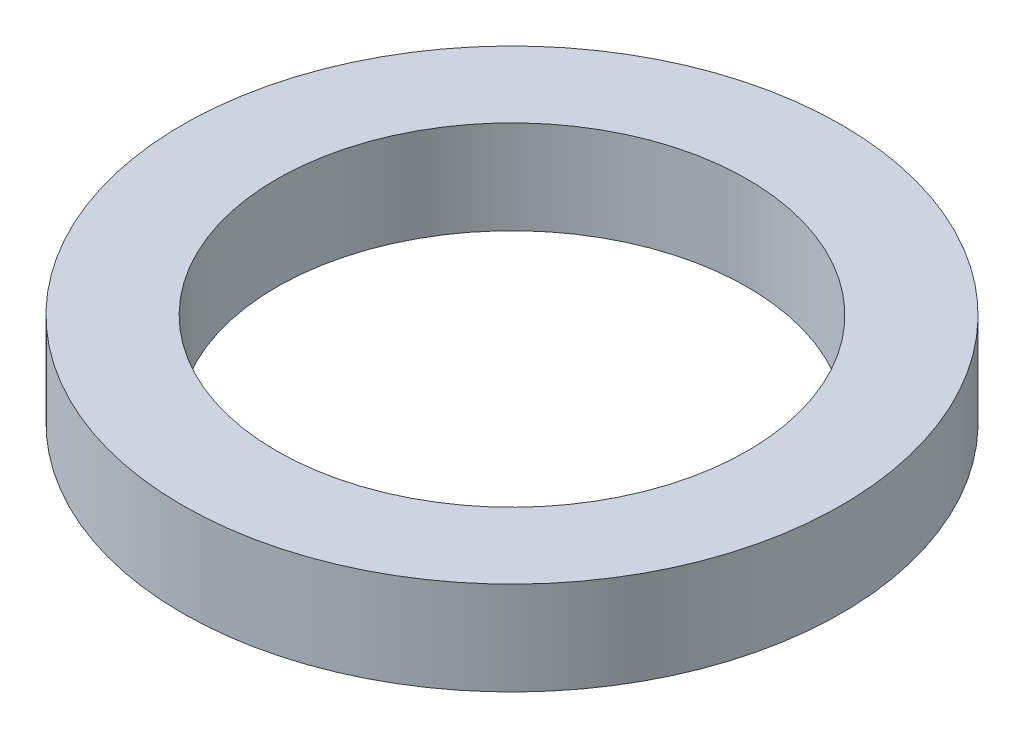
ISO-10303-21;
HEADER;
FILE_DESCRIPTION(('STEP AP214'),'2;1');
FILE_NAME('part.step','',(''),(''),'','','');
FILE_SCHEMA(('AUTOMOTIVE_DESIGN { 1 0 10303 214 1 1 1 1 }'));
ENDSEC;
DATA;
#1=APPLICATION_CONTEXT('core data for automotive mechanical design processes');
#2=APPLICATION_PROTOCOL_DEFINITION('international standard','automotive_design',2000,#1);
#3=PRODUCT_CONTEXT('',#1,'mechanical');
#4=PRODUCT('Part','Part','',(#3));
#5=PRODUCT_RELATED_PRODUCT_CATEGORY('part','',(#4));
#6=PRODUCT_DEFINITION_FORMATION('','',#4);
#7=PRODUCT_DEFINITION_CONTEXT('part definition',#1,'design');
#8=PRODUCT_DEFINITION('design','',#6,#7);
#9=PRODUCT_DEFINITION_SHAPE('','',#8);
#10=(LENGTH_UNIT() NAMED_UNIT(*) SI_UNIT(.MILLI.,.METRE.));
#11=(NAMED_UNIT(*) PLANE_ANGLE_UNIT() SI_UNIT($,.RADIAN.));
#12=(NAMED_UNIT(*) SI_UNIT($,.STERADIAN.) SOLID_ANGLE_UNIT());
#13=UNCERTAINTY_MEASURE_WITH_UNIT(LENGTH_MEASURE(1.E-05),#10,'distance_accuracy_value','');
#14=(GEOMETRIC_REPRESENTATION_CONTEXT(3) GLOBAL_UNCERTAINTY_ASSIGNED_CONTEXT((#13)) GLOBAL_UNIT_ASSIGNED_CONTEXT((#10,
#11,#12)) REPRESENTATION_CONTEXT('',''));
#15=CARTESIAN_POINT('',(0.,0.,0.));
#16=DIRECTION('',(0.,0.,1.));
#17=DIRECTION('',(1.,0.,0.));
#18=AXIS2_PLACEMENT_3D('',#15,#16,#17);
#19=CARTESIAN_POINT('',(0.,0.,0.));
#20=DIRECTION('',(0.,1.,0.));
#21=DIRECTION('',(0.,0.,1.));
#22=AXIS2_PLACEMENT_3D('',#19,#20,#21);
#23=PLANE('',#22);
#24=CARTESIAN_POINT('',(0.,0.,0.));
#25=DIRECTION('',(0.,-1.,0.));
#26=DIRECTION('',(0.,0.,-1.));
#27=AXIS2_PLACEMENT_3D('',#24,#25,#26);
#28=CIRCLE('',#27,5.55625);
#29=CARTESIAN_POINT('',(0.,0.,-5.55625));
#30=VERTEX_POINT('',#29);
#31=EDGE_CURVE('E32',#30,#30,#28,.F.);
#32=ORIENTED_EDGE('',*,*,#31,.F.);
#33=EDGE_LOOP('',(#32));
#34=FACE_BOUND('',#33,.T.);
#35=CARTESIAN_POINT('',(0.,0.,0.));
#36=DIRECTION('',(0.,1.,0.));
#37=DIRECTION('',(0.,0.,1.));
#38=AXIS2_PLACEMENT_3D('',#35,#36,#37);
#39=CIRCLE('',#38,3.96875);
#40=CARTESIAN_POINT('',(0.,0.,3.96875));
#41=VERTEX_POINT('',#40);
#42=EDGE_CURVE('E17',#41,#41,#39,.T.);
#43=ORIENTED_EDGE('',*,*,#42,.T.);
#44=EDGE_LOOP('',(#43));
#45=FACE_BOUND('',#44,.T.);
#46=ADVANCED_FACE('F14',(#34,#45),#23,.F.);
#47=CARTESIAN_POINT('',(0.,0.,0.));
#48=DIRECTION('',(0.,1.,0.));
#49=DIRECTION('',(0.,0.,1.));
#50=AXIS2_PLACEMENT_3D('',#47,#48,#49);
#51=CYLINDRICAL_SURFACE('',#50,3.96875);
#52=CARTESIAN_POINT('',(0.,1.5748,0.));
#53=DIRECTION('',(0.,1.,0.));
#54=DIRECTION('',(0.,0.,1.));
#55=AXIS2_PLACEMENT_3D('',#52,#53,#54);
#56=CIRCLE('',#55,3.96875);
#57=CARTESIAN_POINT('',(0.,1.5748,3.96875));
#58=VERTEX_POINT('',#57);
#59=EDGE_CURVE('E22',#58,#58,#56,.F.);
#60=ORIENTED_EDGE('',*,*,#59,.F.);
#61=EDGE_LOOP('',(#60));
#62=FACE_BOUND('',#61,.T.);
#63=ORIENTED_EDGE('',*,*,#42,.F.);
#64=EDGE_LOOP('',(#63));
#65=FACE_BOUND('',#64,.T.);
#66=ADVANCED_FACE('F44',(#62,#65),#51,.F.);
#67=CARTESIAN_POINT('',(0.,1.5748,0.));
#68=DIRECTION('',(0.,-1.,0.));
#69=DIRECTION('',(0.,0.,-1.));
#70=AXIS2_PLACEMENT_3D('',#67,#68,#69);
#71=CYLINDRICAL_SURFACE('',#70,5.55625);
#72=ORIENTED_EDGE('',*,*,#31,.T.);
#73=EDGE_LOOP('',(#72));
#74=FACE_BOUND('',#73,.T.);
#75=CARTESIAN_POINT('',(0.,1.5748,0.));
#76=DIRECTION('',(0.,-1.,0.));
#77=DIRECTION('',(0.,0.,-1.));
#78=AXIS2_PLACEMENT_3D('',#75,#76,#77);
#79=CIRCLE('',#78,5.55625);
#80=CARTESIAN_POINT('',(0.,1.5748,-5.55625));
#81=VERTEX_POINT('',#80);
#82=EDGE_CURVE('E10',#81,#81,#79,.F.);
#83=ORIENTED_EDGE('',*,*,#82,.F.);
#84=EDGE_LOOP('',(#83));
#85=FACE_BOUND('',#84,.T.);
#86=ADVANCED_FACE('F46',(#74,#85),#71,.T.);
#87=CARTESIAN_POINT('',(0.,1.5748,0.));
#88=DIRECTION('',(0.,1.,0.));
#89=DIRECTION('',(0.,0.,1.));
#90=AXIS2_PLACEMENT_3D('',#87,#88,#89);
#91=PLANE('',#90);
#92=ORIENTED_EDGE('',*,*,#82,.T.);
#93=EDGE_LOOP('',(#92));
#94=FACE_BOUND('',#93,.T.);
#95=ORIENTED_EDGE('',*,*,#59,.T.);
#96=EDGE_LOOP('',(#95));
#97=FACE_BOUND('',#96,.T.);
#98=ADVANCED_FACE('F52',(#94,#97),#91,.T.);
#99=CLOSED_SHELL('',(#46,#66,#86,#98));
#100=MANIFOLD_SOLID_BREP('B1',#99);
#101=ADVANCED_BREP_SHAPE_REPRESENTATION('',(#18,#100),#14);
#102=SHAPE_DEFINITION_REPRESENTATION(#9,#101);
ENDSEC;
END-ISO-10303-21;
